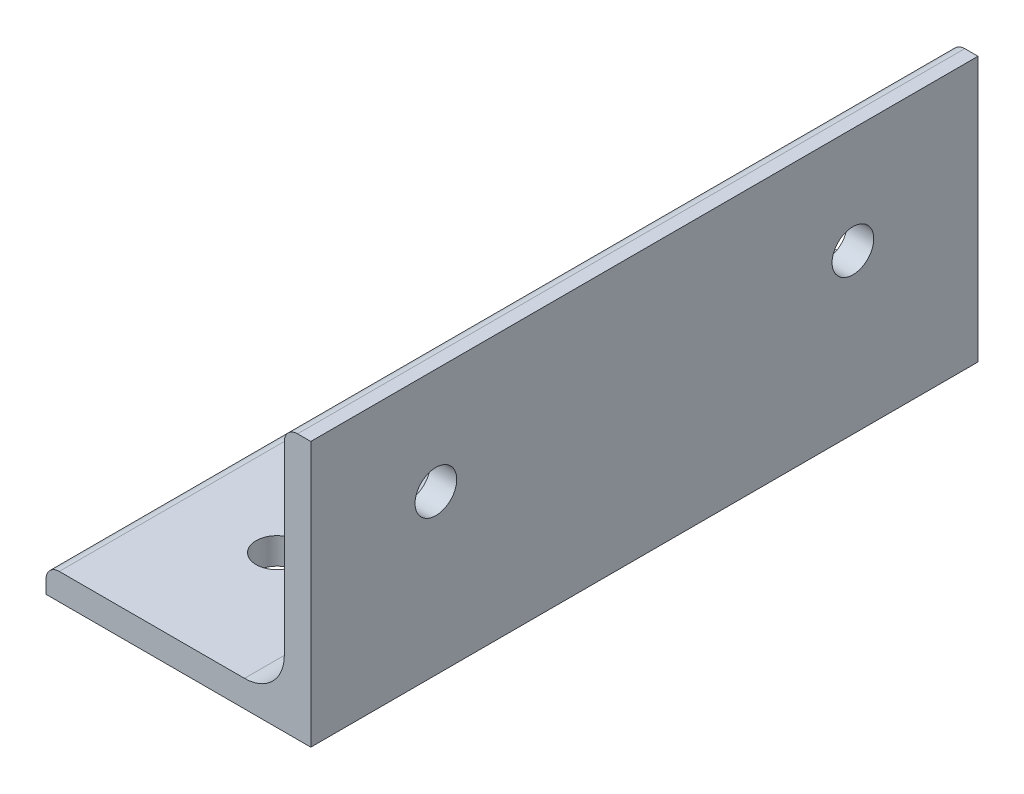
ISO-10303-21;
HEADER;
FILE_DESCRIPTION(('STEP AP214'),'2;1');
FILE_NAME('part.step','',(''),(''),'','','');
FILE_SCHEMA(('AUTOMOTIVE_DESIGN { 1 0 10303 214 1 1 1 1 }'));
ENDSEC;
DATA;
#1=APPLICATION_CONTEXT('core data for automotive mechanical design processes');
#2=APPLICATION_PROTOCOL_DEFINITION('international standard','automotive_design',2000,#1);
#3=PRODUCT_CONTEXT('',#1,'mechanical');
#4=PRODUCT('Part','Part','',(#3));
#5=PRODUCT_RELATED_PRODUCT_CATEGORY('part','',(#4));
#6=PRODUCT_DEFINITION_FORMATION('','',#4);
#7=PRODUCT_DEFINITION_CONTEXT('part definition',#1,'design');
#8=PRODUCT_DEFINITION('design','',#6,#7);
#9=PRODUCT_DEFINITION_SHAPE('','',#8);
#10=(LENGTH_UNIT() NAMED_UNIT(*) SI_UNIT(.MILLI.,.METRE.));
#11=(NAMED_UNIT(*) PLANE_ANGLE_UNIT() SI_UNIT($,.RADIAN.));
#12=(NAMED_UNIT(*) SI_UNIT($,.STERADIAN.) SOLID_ANGLE_UNIT());
#13=UNCERTAINTY_MEASURE_WITH_UNIT(LENGTH_MEASURE(1.E-05),#10,'distance_accuracy_value','');
#14=(GEOMETRIC_REPRESENTATION_CONTEXT(3) GLOBAL_UNCERTAINTY_ASSIGNED_CONTEXT((#13)) GLOBAL_UNIT_ASSIGNED_CONTEXT((#10,
#11,#12)) REPRESENTATION_CONTEXT('',''));
#15=CARTESIAN_POINT('',(0.,0.,0.));
#16=DIRECTION('',(0.,0.,1.));
#17=DIRECTION('',(1.,0.,0.));
#18=AXIS2_PLACEMENT_3D('',#15,#16,#17);
#19=CARTESIAN_POINT('',(-15.875,-14.2875,304.8));
#20=DIRECTION('',(1.,0.,0.));
#21=DIRECTION('',(0.,0.,-1.));
#22=AXIS2_PLACEMENT_3D('',#19,#20,#21);
#23=PLANE('',#22);
#24=DIRECTION('',(0.,1.,0.));
#25=VECTOR('',#24,1.);
#26=CARTESIAN_POINT('',(-15.875,-14.2875,224.8));
#27=LINE('',#26,#25);
#28=CARTESIAN_POINT('',(-15.875,-15.875,224.8));
#29=VERTEX_POINT('',#28);
#30=CARTESIAN_POINT('',(-15.875,-14.2875,224.8));
#31=VERTEX_POINT('',#30);
#32=EDGE_CURVE('E54',#29,#31,#27,.T.);
#33=ORIENTED_EDGE('',*,*,#32,.F.);
#34=DIRECTION('',(0.,0.,-1.));
#35=VECTOR('',#34,1.);
#36=CARTESIAN_POINT('',(-15.875,-15.875,304.8));
#37=LINE('',#36,#35);
#38=CARTESIAN_POINT('',(-15.875,-15.875,304.8));
#39=VERTEX_POINT('',#38);
#40=EDGE_CURVE('E48',#39,#29,#37,.T.);
#41=ORIENTED_EDGE('',*,*,#40,.F.);
#42=DIRECTION('',(0.,-1.,0.));
#43=VECTOR('',#42,1.);
#44=CARTESIAN_POINT('',(-15.875,-14.2875,304.8));
#45=LINE('',#44,#43);
#46=CARTESIAN_POINT('',(-15.875,-14.2875,304.8));
#47=VERTEX_POINT('',#46);
#48=EDGE_CURVE('E168',#47,#39,#45,.T.);
#49=ORIENTED_EDGE('',*,*,#48,.F.);
#50=DIRECTION('',(0.,0.,-1.));
#51=VECTOR('',#50,1.);
#52=CARTESIAN_POINT('',(-15.875,-14.2875,304.8));
#53=LINE('',#52,#51);
#54=EDGE_CURVE('E151',#47,#31,#53,.T.);
#55=ORIENTED_EDGE('',*,*,#54,.T.);
#56=EDGE_LOOP('',(#33,#41,#49,#55));
#57=FACE_BOUND('',#56,.T.);
#58=ADVANCED_FACE('F41',(#57),#23,.F.);
#59=CARTESIAN_POINT('',(-15.875,-15.875,304.8));
#60=DIRECTION('',(0.,1.,0.));
#61=DIRECTION('',(-1.,0.,0.));
#62=AXIS2_PLACEMENT_3D('',#59,#60,#61);
#63=PLANE('',#62);
#64=CARTESIAN_POINT('',(-3.18135,-15.875,239.8));
#65=DIRECTION('',(0.,1.,0.));
#66=DIRECTION('',(-1.,0.,0.));
#67=AXIS2_PLACEMENT_3D('',#64,#65,#66);
#68=CIRCLE('',#67,2.5);
#69=CARTESIAN_POINT('',(-5.68135,-15.875,239.8));
#70=VERTEX_POINT('',#69);
#71=EDGE_CURVE('E188',#70,#70,#68,.T.);
#72=ORIENTED_EDGE('',*,*,#71,.T.);
#73=EDGE_LOOP('',(#72));
#74=FACE_BOUND('',#73,.T.);
#75=CARTESIAN_POINT('',(-3.18135,-15.875,289.8));
#76=DIRECTION('',(0.,1.,0.));
#77=DIRECTION('',(-1.,0.,0.));
#78=AXIS2_PLACEMENT_3D('',#75,#76,#77);
#79=CIRCLE('',#78,2.5);
#80=CARTESIAN_POINT('',(-5.68134999999999,-15.875,289.8));
#81=VERTEX_POINT('',#80);
#82=EDGE_CURVE('E193',#81,#81,#79,.T.);
#83=ORIENTED_EDGE('',*,*,#82,.T.);
#84=EDGE_LOOP('',(#83));
#85=FACE_BOUND('',#84,.T.);
#86=DIRECTION('',(1.,0.,0.));
#87=VECTOR('',#86,1.);
#88=CARTESIAN_POINT('',(15.875,-15.875,224.8));
#89=LINE('',#88,#87);
#90=CARTESIAN_POINT('',(15.875,-15.875,224.8));
#91=VERTEX_POINT('',#90);
#92=EDGE_CURVE('E112',#29,#91,#89,.T.);
#93=ORIENTED_EDGE('',*,*,#92,.T.);
#94=DIRECTION('',(0.,0.,-1.));
#95=VECTOR('',#94,1.);
#96=CARTESIAN_POINT('',(15.875,-15.875,304.8));
#97=LINE('',#96,#95);
#98=CARTESIAN_POINT('',(15.875,-15.875,304.8));
#99=VERTEX_POINT('',#98);
#100=EDGE_CURVE('E125',#99,#91,#97,.T.);
#101=ORIENTED_EDGE('',*,*,#100,.F.);
#102=DIRECTION('',(1.,0.,0.));
#103=VECTOR('',#102,1.);
#104=CARTESIAN_POINT('',(-15.875,-15.875,304.8));
#105=LINE('',#104,#103);
#106=EDGE_CURVE('E166',#39,#99,#105,.T.);
#107=ORIENTED_EDGE('',*,*,#106,.F.);
#108=ORIENTED_EDGE('',*,*,#40,.T.);
#109=EDGE_LOOP('',(#93,#101,#107,#108));
#110=FACE_BOUND('',#109,.T.);
#111=ADVANCED_FACE('F124',(#74,#85,#110),#63,.F.);
#112=CARTESIAN_POINT('',(15.875,-15.875,304.8));
#113=DIRECTION('',(-1.,0.,0.));
#114=DIRECTION('',(0.,-1.,0.));
#115=AXIS2_PLACEMENT_3D('',#112,#113,#114);
#116=PLANE('',#115);
#117=CARTESIAN_POINT('',(15.875,3.18135,289.8));
#118=DIRECTION('',(-1.,0.,0.));
#119=DIRECTION('',(0.,-1.,0.));
#120=AXIS2_PLACEMENT_3D('',#117,#118,#119);
#121=CIRCLE('',#120,2.50000000000002);
#122=CARTESIAN_POINT('',(15.875,0.681349999999979,289.8));
#123=VERTEX_POINT('',#122);
#124=EDGE_CURVE('E119',#123,#123,#121,.T.);
#125=ORIENTED_EDGE('',*,*,#124,.T.);
#126=EDGE_LOOP('',(#125));
#127=FACE_BOUND('',#126,.T.);
#128=CARTESIAN_POINT('',(15.875,3.18135,239.8));
#129=DIRECTION('',(-1.,0.,0.));
#130=DIRECTION('',(0.,-1.,0.));
#131=AXIS2_PLACEMENT_3D('',#128,#129,#130);
#132=CIRCLE('',#131,2.5);
#133=CARTESIAN_POINT('',(15.875,0.681350000000005,239.8));
#134=VERTEX_POINT('',#133);
#135=EDGE_CURVE('E181',#134,#134,#132,.T.);
#136=ORIENTED_EDGE('',*,*,#135,.T.);
#137=EDGE_LOOP('',(#136));
#138=FACE_BOUND('',#137,.T.);
#139=DIRECTION('',(0.,1.,0.));
#140=VECTOR('',#139,1.);
#141=CARTESIAN_POINT('',(15.875,-15.875,224.8));
#142=LINE('',#141,#140);
#143=CARTESIAN_POINT('',(15.875,15.875,224.8));
#144=VERTEX_POINT('',#143);
#145=EDGE_CURVE('E109',#91,#144,#142,.T.);
#146=ORIENTED_EDGE('',*,*,#145,.T.);
#147=DIRECTION('',(0.,0.,-1.));
#148=VECTOR('',#147,1.);
#149=CARTESIAN_POINT('',(15.875,15.875,304.8));
#150=LINE('',#149,#148);
#151=CARTESIAN_POINT('',(15.875,15.875,304.8));
#152=VERTEX_POINT('',#151);
#153=EDGE_CURVE('E132',#152,#144,#150,.T.);
#154=ORIENTED_EDGE('',*,*,#153,.F.);
#155=DIRECTION('',(0.,1.,0.));
#156=VECTOR('',#155,1.);
#157=CARTESIAN_POINT('',(15.875,-15.875,304.8));
#158=LINE('',#157,#156);
#159=EDGE_CURVE('E131',#99,#152,#158,.T.);
#160=ORIENTED_EDGE('',*,*,#159,.F.);
#161=ORIENTED_EDGE('',*,*,#100,.T.);
#162=EDGE_LOOP('',(#146,#154,#160,#161));
#163=FACE_BOUND('',#162,.T.);
#164=ADVANCED_FACE('F130',(#127,#138,#163),#116,.F.);
#165=CARTESIAN_POINT('',(14.2875,15.875,304.8));
#166=DIRECTION('',(0.,-1.,0.));
#167=DIRECTION('',(1.,0.,0.));
#168=AXIS2_PLACEMENT_3D('',#165,#166,#167);
#169=PLANE('',#168);
#170=DIRECTION('',(1.,0.,0.));
#171=VECTOR('',#170,1.);
#172=CARTESIAN_POINT('',(14.2875,15.875,224.8));
#173=LINE('',#172,#171);
#174=CARTESIAN_POINT('',(14.2875,15.875,224.8));
#175=VERTEX_POINT('',#174);
#176=EDGE_CURVE('E114',#175,#144,#173,.T.);
#177=ORIENTED_EDGE('',*,*,#176,.F.);
#178=DIRECTION('',(0.,0.,-1.));
#179=VECTOR('',#178,1.);
#180=CARTESIAN_POINT('',(14.2875,15.875,304.8));
#181=LINE('',#180,#179);
#182=CARTESIAN_POINT('',(14.2875,15.875,304.8));
#183=VERTEX_POINT('',#182);
#184=EDGE_CURVE('E134',#183,#175,#181,.T.);
#185=ORIENTED_EDGE('',*,*,#184,.F.);
#186=DIRECTION('',(-1.,0.,0.));
#187=VECTOR('',#186,1.);
#188=CARTESIAN_POINT('',(14.2875,15.875,304.8));
#189=LINE('',#188,#187);
#190=EDGE_CURVE('E163',#152,#183,#189,.T.);
#191=ORIENTED_EDGE('',*,*,#190,.F.);
#192=ORIENTED_EDGE('',*,*,#153,.T.);
#193=EDGE_LOOP('',(#177,#185,#191,#192));
#194=FACE_BOUND('',#193,.T.);
#195=ADVANCED_FACE('F226',(#194),#169,.F.);
#196=CARTESIAN_POINT('',(14.2875,14.2875,304.8));
#197=DIRECTION('',(0.,0.,-1.));
#198=DIRECTION('',(-1.,0.,0.));
#199=AXIS2_PLACEMENT_3D('',#196,#197,#198);
#200=CYLINDRICAL_SURFACE('',#199,1.5875);
#201=CARTESIAN_POINT('',(14.2875,14.2875,224.8));
#202=DIRECTION('',(0.,0.,-1.));
#203=DIRECTION('',(-1.,0.,0.));
#204=AXIS2_PLACEMENT_3D('',#201,#202,#203);
#205=CIRCLE('',#204,1.5875);
#206=CARTESIAN_POINT('',(12.7,14.2875,224.8));
#207=VERTEX_POINT('',#206);
#208=EDGE_CURVE('E172',#207,#175,#205,.T.);
#209=ORIENTED_EDGE('',*,*,#208,.F.);
#210=DIRECTION('',(0.,0.,-1.));
#211=VECTOR('',#210,1.);
#212=CARTESIAN_POINT('',(12.7,14.2875,304.8));
#213=LINE('',#212,#211);
#214=CARTESIAN_POINT('',(12.7,14.2875,304.8));
#215=VERTEX_POINT('',#214);
#216=EDGE_CURVE('E139',#215,#207,#213,.T.);
#217=ORIENTED_EDGE('',*,*,#216,.F.);
#218=CARTESIAN_POINT('',(14.2875,14.2875,304.8));
#219=DIRECTION('',(0.,0.,1.));
#220=DIRECTION('',(-1.,0.,0.));
#221=AXIS2_PLACEMENT_3D('',#218,#219,#220);
#222=CIRCLE('',#221,1.5875);
#223=EDGE_CURVE('E161',#183,#215,#222,.T.);
#224=ORIENTED_EDGE('',*,*,#223,.F.);
#225=ORIENTED_EDGE('',*,*,#184,.T.);
#226=EDGE_LOOP('',(#209,#217,#224,#225));
#227=FACE_BOUND('',#226,.T.);
#228=ADVANCED_FACE('F231',(#227),#200,.T.);
#229=CARTESIAN_POINT('',(12.7,14.2875,304.8));
#230=DIRECTION('',(1.,0.,0.));
#231=DIRECTION('',(0.,1.,0.));
#232=AXIS2_PLACEMENT_3D('',#229,#230,#231);
#233=PLANE('',#232);
#234=CARTESIAN_POINT('',(12.7,3.18135,289.8));
#235=DIRECTION('',(-1.,0.,0.));
#236=DIRECTION('',(0.,-1.,0.));
#237=AXIS2_PLACEMENT_3D('',#234,#235,#236);
#238=CIRCLE('',#237,2.50000000000002);
#239=CARTESIAN_POINT('',(12.7,0.681349999999978,289.8));
#240=VERTEX_POINT('',#239);
#241=EDGE_CURVE('E184',#240,#240,#238,.T.);
#242=ORIENTED_EDGE('',*,*,#241,.F.);
#243=EDGE_LOOP('',(#242));
#244=FACE_BOUND('',#243,.T.);
#245=CARTESIAN_POINT('',(12.7,3.18135,239.8));
#246=DIRECTION('',(-1.,0.,0.));
#247=DIRECTION('',(0.,-1.,0.));
#248=AXIS2_PLACEMENT_3D('',#245,#246,#247);
#249=CIRCLE('',#248,2.5);
#250=CARTESIAN_POINT('',(12.7,0.681350000000005,239.8));
#251=VERTEX_POINT('',#250);
#252=EDGE_CURVE('E185',#251,#251,#249,.T.);
#253=ORIENTED_EDGE('',*,*,#252,.F.);
#254=EDGE_LOOP('',(#253));
#255=FACE_BOUND('',#254,.T.);
#256=DIRECTION('',(0.,1.,0.));
#257=VECTOR('',#256,1.);
#258=CARTESIAN_POINT('',(12.7,14.2875,224.8));
#259=LINE('',#258,#257);
#260=CARTESIAN_POINT('',(12.7,-7.9248,224.8));
#261=VERTEX_POINT('',#260);
#262=EDGE_CURVE('E174',#261,#207,#259,.T.);
#263=ORIENTED_EDGE('',*,*,#262,.F.);
#264=DIRECTION('',(0.,0.,-1.));
#265=VECTOR('',#264,1.);
#266=CARTESIAN_POINT('',(12.7,-7.9248,304.8));
#267=LINE('',#266,#265);
#268=CARTESIAN_POINT('',(12.7,-7.9248,304.8));
#269=VERTEX_POINT('',#268);
#270=EDGE_CURVE('E142',#269,#261,#267,.T.);
#271=ORIENTED_EDGE('',*,*,#270,.F.);
#272=DIRECTION('',(0.,-1.,0.));
#273=VECTOR('',#272,1.);
#274=CARTESIAN_POINT('',(12.7,14.2875,304.8));
#275=LINE('',#274,#273);
#276=EDGE_CURVE('E159',#215,#269,#275,.T.);
#277=ORIENTED_EDGE('',*,*,#276,.F.);
#278=ORIENTED_EDGE('',*,*,#216,.T.);
#279=EDGE_LOOP('',(#263,#271,#277,#278));
#280=FACE_BOUND('',#279,.T.);
#281=ADVANCED_FACE('F237',(#244,#255,#280),#233,.F.);
#282=CARTESIAN_POINT('',(7.92480000000001,-7.9248,304.8));
#283=DIRECTION('',(0.,0.,-1.));
#284=DIRECTION('',(-1.,0.,0.));
#285=AXIS2_PLACEMENT_3D('',#282,#283,#284);
#286=CYLINDRICAL_SURFACE('',#285,4.7752);
#287=CARTESIAN_POINT('',(7.92480000000001,-7.9248,224.8));
#288=DIRECTION('',(0.,0.,-1.));
#289=DIRECTION('',(-1.,0.,0.));
#290=AXIS2_PLACEMENT_3D('',#287,#288,#289);
#291=CIRCLE('',#290,4.7752);
#292=CARTESIAN_POINT('',(7.92480000000001,-12.7,224.8));
#293=VERTEX_POINT('',#292);
#294=EDGE_CURVE('E176',#293,#261,#291,.F.);
#295=ORIENTED_EDGE('',*,*,#294,.F.);
#296=DIRECTION('',(0.,0.,-1.));
#297=VECTOR('',#296,1.);
#298=CARTESIAN_POINT('',(7.92480000000001,-12.7,304.8));
#299=LINE('',#298,#297);
#300=CARTESIAN_POINT('',(7.92480000000001,-12.7,304.8));
#301=VERTEX_POINT('',#300);
#302=EDGE_CURVE('E145',#301,#293,#299,.T.);
#303=ORIENTED_EDGE('',*,*,#302,.F.);
#304=CARTESIAN_POINT('',(7.92480000000001,-7.9248,304.8));
#305=DIRECTION('',(0.,0.,-1.));
#306=DIRECTION('',(-1.,0.,0.));
#307=AXIS2_PLACEMENT_3D('',#304,#305,#306);
#308=CIRCLE('',#307,4.7752);
#309=EDGE_CURVE('E157',#269,#301,#308,.T.);
#310=ORIENTED_EDGE('',*,*,#309,.F.);
#311=ORIENTED_EDGE('',*,*,#270,.T.);
#312=EDGE_LOOP('',(#295,#303,#310,#311));
#313=FACE_BOUND('',#312,.T.);
#314=ADVANCED_FACE('F210',(#313),#286,.F.);
#315=CARTESIAN_POINT('',(7.92480000000001,-12.7,304.8));
#316=DIRECTION('',(0.,-1.,0.));
#317=DIRECTION('',(1.,0.,0.));
#318=AXIS2_PLACEMENT_3D('',#315,#316,#317);
#319=PLANE('',#318);
#320=CARTESIAN_POINT('',(-3.18135,-12.7,239.8));
#321=DIRECTION('',(0.,1.,0.));
#322=DIRECTION('',(-1.,0.,0.));
#323=AXIS2_PLACEMENT_3D('',#320,#321,#322);
#324=CIRCLE('',#323,2.5);
#325=CARTESIAN_POINT('',(-5.68135,-12.7,239.8));
#326=VERTEX_POINT('',#325);
#327=EDGE_CURVE('E196',#326,#326,#324,.T.);
#328=ORIENTED_EDGE('',*,*,#327,.F.);
#329=EDGE_LOOP('',(#328));
#330=FACE_BOUND('',#329,.T.);
#331=CARTESIAN_POINT('',(-3.18135,-12.7,289.8));
#332=DIRECTION('',(0.,1.,0.));
#333=DIRECTION('',(-1.,0.,0.));
#334=AXIS2_PLACEMENT_3D('',#331,#332,#333);
#335=CIRCLE('',#334,2.5);
#336=CARTESIAN_POINT('',(-5.68134999999999,-12.7,289.8));
#337=VERTEX_POINT('',#336);
#338=EDGE_CURVE('E197',#337,#337,#335,.T.);
#339=ORIENTED_EDGE('',*,*,#338,.F.);
#340=EDGE_LOOP('',(#339));
#341=FACE_BOUND('',#340,.T.);
#342=DIRECTION('',(1.,0.,0.));
#343=VECTOR('',#342,1.);
#344=CARTESIAN_POINT('',(7.92480000000001,-12.7,224.8));
#345=LINE('',#344,#343);
#346=CARTESIAN_POINT('',(-14.2875,-12.7,224.8));
#347=VERTEX_POINT('',#346);
#348=EDGE_CURVE('E128',#347,#293,#345,.T.);
#349=ORIENTED_EDGE('',*,*,#348,.F.);
#350=DIRECTION('',(0.,0.,-1.));
#351=VECTOR('',#350,1.);
#352=CARTESIAN_POINT('',(-14.2875,-12.7,304.8));
#353=LINE('',#352,#351);
#354=CARTESIAN_POINT('',(-14.2875,-12.7,304.8));
#355=VERTEX_POINT('',#354);
#356=EDGE_CURVE('E148',#355,#347,#353,.T.);
#357=ORIENTED_EDGE('',*,*,#356,.F.);
#358=DIRECTION('',(-1.,0.,0.));
#359=VECTOR('',#358,1.);
#360=CARTESIAN_POINT('',(7.92480000000001,-12.7,304.8));
#361=LINE('',#360,#359);
#362=EDGE_CURVE('E155',#301,#355,#361,.T.);
#363=ORIENTED_EDGE('',*,*,#362,.F.);
#364=ORIENTED_EDGE('',*,*,#302,.T.);
#365=EDGE_LOOP('',(#349,#357,#363,#364));
#366=FACE_BOUND('',#365,.T.);
#367=ADVANCED_FACE('F206',(#330,#341,#366),#319,.F.);
#368=CARTESIAN_POINT('',(-14.2875,-14.2875,304.8));
#369=DIRECTION('',(0.,0.,-1.));
#370=DIRECTION('',(-1.,0.,0.));
#371=AXIS2_PLACEMENT_3D('',#368,#369,#370);
#372=CYLINDRICAL_SURFACE('',#371,1.5875);
#373=CARTESIAN_POINT('',(-14.2875,-14.2875,224.8));
#374=DIRECTION('',(0.,0.,-1.));
#375=DIRECTION('',(-1.,0.,0.));
#376=AXIS2_PLACEMENT_3D('',#373,#374,#375);
#377=CIRCLE('',#376,1.5875);
#378=EDGE_CURVE('E12',#31,#347,#377,.T.);
#379=ORIENTED_EDGE('',*,*,#378,.F.);
#380=ORIENTED_EDGE('',*,*,#54,.F.);
#381=CARTESIAN_POINT('',(-14.2875,-14.2875,304.8));
#382=DIRECTION('',(0.,0.,1.));
#383=DIRECTION('',(-1.,0.,0.));
#384=AXIS2_PLACEMENT_3D('',#381,#382,#383);
#385=CIRCLE('',#384,1.5875);
#386=EDGE_CURVE('E62',#355,#47,#385,.T.);
#387=ORIENTED_EDGE('',*,*,#386,.F.);
#388=ORIENTED_EDGE('',*,*,#356,.T.);
#389=EDGE_LOOP('',(#379,#380,#387,#388));
#390=FACE_BOUND('',#389,.T.);
#391=ADVANCED_FACE('F209',(#390),#372,.T.);
#392=CARTESIAN_POINT('',(14.2875,14.2875,304.8));
#393=DIRECTION('',(0.,0.,-1.));
#394=DIRECTION('',(-1.,0.,0.));
#395=AXIS2_PLACEMENT_3D('',#392,#393,#394);
#396=PLANE('',#395);
#397=ORIENTED_EDGE('',*,*,#48,.T.);
#398=ORIENTED_EDGE('',*,*,#106,.T.);
#399=ORIENTED_EDGE('',*,*,#159,.T.);
#400=ORIENTED_EDGE('',*,*,#190,.T.);
#401=ORIENTED_EDGE('',*,*,#223,.T.);
#402=ORIENTED_EDGE('',*,*,#276,.T.);
#403=ORIENTED_EDGE('',*,*,#309,.T.);
#404=ORIENTED_EDGE('',*,*,#362,.T.);
#405=ORIENTED_EDGE('',*,*,#386,.T.);
#406=EDGE_LOOP('',(#397,#398,#399,#400,#401,#402,#403,#404,#405));
#407=FACE_BOUND('',#406,.T.);
#408=ADVANCED_FACE('F222',(#407),#396,.F.);
#409=CARTESIAN_POINT('',(14.2875,14.2875,224.8));
#410=DIRECTION('',(0.,0.,-1.));
#411=DIRECTION('',(-1.,0.,0.));
#412=AXIS2_PLACEMENT_3D('',#409,#410,#411);
#413=PLANE('',#412);
#414=ORIENTED_EDGE('',*,*,#32,.T.);
#415=ORIENTED_EDGE('',*,*,#378,.T.);
#416=ORIENTED_EDGE('',*,*,#348,.T.);
#417=ORIENTED_EDGE('',*,*,#294,.T.);
#418=ORIENTED_EDGE('',*,*,#262,.T.);
#419=ORIENTED_EDGE('',*,*,#208,.T.);
#420=ORIENTED_EDGE('',*,*,#176,.T.);
#421=ORIENTED_EDGE('',*,*,#145,.F.);
#422=ORIENTED_EDGE('',*,*,#92,.F.);
#423=EDGE_LOOP('',(#414,#415,#416,#417,#418,#419,#420,#421,#422));
#424=FACE_BOUND('',#423,.T.);
#425=ADVANCED_FACE('F111',(#424),#413,.T.);
#426=CARTESIAN_POINT('',(114.3,3.18135000000002,239.8));
#427=DIRECTION('',(-1.,0.,0.));
#428=DIRECTION('',(0.,-1.,0.));
#429=AXIS2_PLACEMENT_3D('',#426,#427,#428);
#430=CYLINDRICAL_SURFACE('',#429,2.5);
#431=ORIENTED_EDGE('',*,*,#252,.T.);
#432=EDGE_LOOP('',(#431));
#433=FACE_BOUND('',#432,.T.);
#434=ORIENTED_EDGE('',*,*,#135,.F.);
#435=EDGE_LOOP('',(#434));
#436=FACE_BOUND('',#435,.T.);
#437=ADVANCED_FACE('F296',(#433,#436),#430,.F.);
#438=CARTESIAN_POINT('',(114.3,3.18135000000002,289.8));
#439=DIRECTION('',(-1.,0.,0.));
#440=DIRECTION('',(0.,-1.,0.));
#441=AXIS2_PLACEMENT_3D('',#438,#439,#440);
#442=CYLINDRICAL_SURFACE('',#441,2.50000000000002);
#443=ORIENTED_EDGE('',*,*,#241,.T.);
#444=EDGE_LOOP('',(#443));
#445=FACE_BOUND('',#444,.T.);
#446=ORIENTED_EDGE('',*,*,#124,.F.);
#447=EDGE_LOOP('',(#446));
#448=FACE_BOUND('',#447,.T.);
#449=ADVANCED_FACE('F304',(#445,#448),#442,.F.);
#450=CARTESIAN_POINT('',(-3.18134999999999,-114.3,289.8));
#451=DIRECTION('',(0.,1.,0.));
#452=DIRECTION('',(-1.,0.,0.));
#453=AXIS2_PLACEMENT_3D('',#450,#451,#452);
#454=CYLINDRICAL_SURFACE('',#453,2.5);
#455=ORIENTED_EDGE('',*,*,#338,.T.);
#456=EDGE_LOOP('',(#455));
#457=FACE_BOUND('',#456,.T.);
#458=ORIENTED_EDGE('',*,*,#82,.F.);
#459=EDGE_LOOP('',(#458));
#460=FACE_BOUND('',#459,.T.);
#461=ADVANCED_FACE('F312',(#457,#460),#454,.F.);
#462=CARTESIAN_POINT('',(-3.18134999999999,-114.3,239.8));
#463=DIRECTION('',(0.,1.,0.));
#464=DIRECTION('',(-1.,0.,0.));
#465=AXIS2_PLACEMENT_3D('',#462,#463,#464);
#466=CYLINDRICAL_SURFACE('',#465,2.5);
#467=ORIENTED_EDGE('',*,*,#327,.T.);
#468=EDGE_LOOP('',(#467));
#469=FACE_BOUND('',#468,.T.);
#470=ORIENTED_EDGE('',*,*,#71,.F.);
#471=EDGE_LOOP('',(#470));
#472=FACE_BOUND('',#471,.T.);
#473=ADVANCED_FACE('F203',(#469,#472),#466,.F.);
#474=CLOSED_SHELL('',(#58,#111,#164,#195,#228,#281,#314,#367,#391,#408,#425,#437,#449,#461,#473));
#475=MANIFOLD_SOLID_BREP('B2',#474);
#476=ADVANCED_BREP_SHAPE_REPRESENTATION('',(#18,#475),#14);
#477=SHAPE_DEFINITION_REPRESENTATION(#9,#476);
ENDSEC;
END-ISO-10303-21;
